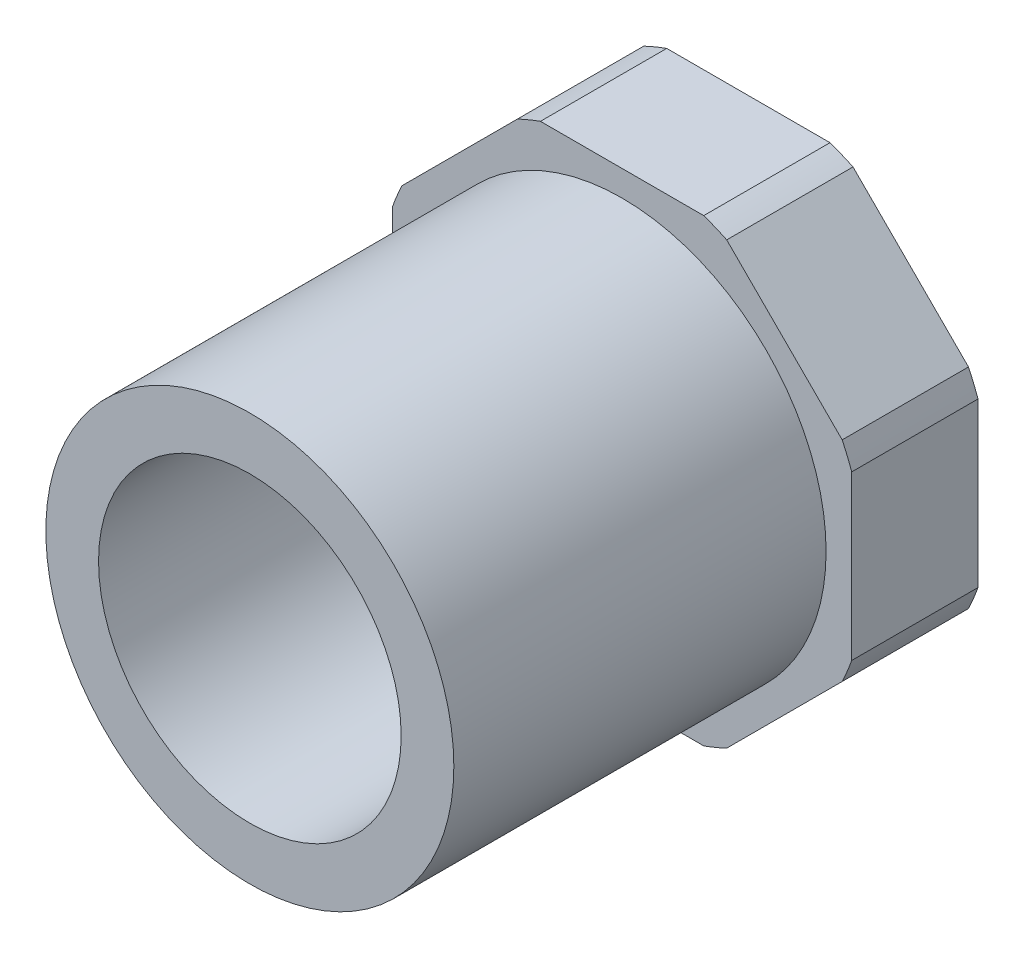
ISO-10303-21;
HEADER;
FILE_DESCRIPTION(('STEP AP214'),'2;1');
FILE_NAME('part.step','',(''),(''),'','','');
FILE_SCHEMA(('AUTOMOTIVE_DESIGN { 1 0 10303 214 1 1 1 1 }'));
ENDSEC;
DATA;
#1=APPLICATION_CONTEXT('core data for automotive mechanical design processes');
#2=APPLICATION_PROTOCOL_DEFINITION('international standard','automotive_design',2000,#1);
#3=PRODUCT_CONTEXT('',#1,'mechanical');
#4=PRODUCT('Part','Part','',(#3));
#5=PRODUCT_RELATED_PRODUCT_CATEGORY('part','',(#4));
#6=PRODUCT_DEFINITION_FORMATION('','',#4);
#7=PRODUCT_DEFINITION_CONTEXT('part definition',#1,'design');
#8=PRODUCT_DEFINITION('design','',#6,#7);
#9=PRODUCT_DEFINITION_SHAPE('','',#8);
#10=(LENGTH_UNIT() NAMED_UNIT(*) SI_UNIT(.MILLI.,.METRE.));
#11=(NAMED_UNIT(*) PLANE_ANGLE_UNIT() SI_UNIT($,.RADIAN.));
#12=(NAMED_UNIT(*) SI_UNIT($,.STERADIAN.) SOLID_ANGLE_UNIT());
#13=UNCERTAINTY_MEASURE_WITH_UNIT(LENGTH_MEASURE(1.E-05),#10,'distance_accuracy_value','');
#14=(GEOMETRIC_REPRESENTATION_CONTEXT(3) GLOBAL_UNCERTAINTY_ASSIGNED_CONTEXT((#13)) GLOBAL_UNIT_ASSIGNED_CONTEXT((#10,
#11,#12)) REPRESENTATION_CONTEXT('',''));
#15=CARTESIAN_POINT('',(0.,0.,0.));
#16=DIRECTION('',(0.,0.,1.));
#17=DIRECTION('',(1.,0.,0.));
#18=AXIS2_PLACEMENT_3D('',#15,#16,#17);
#19=CARTESIAN_POINT('',(0.,0.,13.096875));
#20=DIRECTION('',(0.,0.,1.));
#21=DIRECTION('',(1.,0.,0.));
#22=AXIS2_PLACEMENT_3D('',#19,#20,#21);
#23=CYLINDRICAL_SURFACE('',#22,10.7188);
#24=CARTESIAN_POINT('',(0.,0.,13.096875));
#25=DIRECTION('',(0.,0.,1.));
#26=DIRECTION('',(1.,0.,0.));
#27=AXIS2_PLACEMENT_3D('',#24,#25,#26);
#28=CIRCLE('',#27,10.7188);
#29=CARTESIAN_POINT('',(10.7188,0.,13.096875));
#30=VERTEX_POINT('',#29);
#31=EDGE_CURVE('E179',#30,#30,#28,.T.);
#32=ORIENTED_EDGE('',*,*,#31,.F.);
#33=EDGE_LOOP('',(#32));
#34=FACE_BOUND('',#33,.T.);
#35=CARTESIAN_POINT('',(0.,0.,-6.461125));
#36=DIRECTION('',(0.,0.,-1.));
#37=DIRECTION('',(0.,1.,0.));
#38=AXIS2_PLACEMENT_3D('',#35,#36,#37);
#39=CIRCLE('',#38,10.7188);
#40=CARTESIAN_POINT('',(0.,10.7188,-6.461125));
#41=VERTEX_POINT('',#40);
#42=EDGE_CURVE('E238',#41,#41,#39,.T.);
#43=ORIENTED_EDGE('',*,*,#42,.F.);
#44=EDGE_LOOP('',(#43));
#45=FACE_BOUND('',#44,.T.);
#46=ADVANCED_FACE('F32',(#34,#45),#23,.T.);
#47=CARTESIAN_POINT('',(0.,0.,14.2399258000002));
#48=DIRECTION('',(0.,0.,1.));
#49=DIRECTION('',(0.,-1.,0.));
#50=AXIS2_PLACEMENT_3D('',#47,#48,#49);
#51=SPHERICAL_SURFACE('',#50,20.7010508000002);
#52=CARTESIAN_POINT('',(0.,0.,-6.36579573756222));
#53=DIRECTION('',(0.,0.,1.));
#54=DIRECTION('',(1.,0.,0.));
#55=AXIS2_PLACEMENT_3D('',#52,#53,#54);
#56=CIRCLE('',#55,1.984375);
#57=CARTESIAN_POINT('',(0.,-1.98437500000001,-6.36579573756222));
#58=VERTEX_POINT('',#57);
#59=EDGE_CURVE('E157',#58,#58,#56,.T.);
#60=CARTESIAN_POINT('',(0.,0.,-4.87362500000002));
#61=DIRECTION('',(0.,0.,1.));
#62=DIRECTION('',(1.,0.,0.));
#63=AXIS2_PLACEMENT_3D('',#60,#61,#62);
#64=CIRCLE('',#63,7.95019999999999);
#65=CARTESIAN_POINT('',(0.,-7.95019999999999,-4.87362500000002));
#66=VERTEX_POINT('',#65);
#67=EDGE_CURVE('E185',#66,#66,#64,.T.);
#68=CARTESIAN_POINT('',(0.,-1.98437500000001,-6.36579573756222));
#69=CARTESIAN_POINT('',(0.,-2.04837521383529,-6.35963238964144));
#70=CARTESIAN_POINT('',(0.,-2.11234671120058,-6.35317085188046));
#71=CARTESIAN_POINT('',(0.,-2.24022672321183,-6.33965199847277));
#72=CARTESIAN_POINT('',(0.,-2.3041352378578,-6.33259468282606));
#73=CARTESIAN_POINT('',(0.,-2.43188373465112,-6.31788487544154));
#74=CARTESIAN_POINT('',(0.,-2.49572371679848,-6.31023238370374));
#75=CARTESIAN_POINT('',(0.,-2.62332960623056,-6.29433289146571));
#76=CARTESIAN_POINT('',(0.,-2.68709551351528,-6.28608589096548));
#77=CARTESIAN_POINT('',(0.,-2.81454771689678,-6.26899809643351));
#78=CARTESIAN_POINT('',(0.,-2.87823401299355,-6.26015730240178));
#79=CARTESIAN_POINT('',(0.,-3.00552146469095,-6.2418826885868));
#80=CARTESIAN_POINT('',(0.,-3.06912262029158,-6.23244886880356));
#81=CARTESIAN_POINT('',(0.,-3.19623426905234,-6.21298902248622));
#82=CARTESIAN_POINT('',(0.,-3.25974476221248,-6.20296299595212));
#83=CARTESIAN_POINT('',(0.,-3.38666957202688,-6.18231960662136));
#84=CARTESIAN_POINT('',(0.,-3.45008388868115,-6.17170224382469));
#85=CARTESIAN_POINT('',(0.,-3.5768108397666,-6.14987710377856));
#86=CARTESIAN_POINT('',(0.,-3.64012347419779,-6.13866932652909));
#87=CARTESIAN_POINT('',(0.,-3.76664156394859,-6.11566433065282));
#88=CARTESIAN_POINT('',(0.,-3.82984701926821,-6.10386711202601));
#89=CARTESIAN_POINT('',(0.,-3.95614526321268,-6.07968425764527));
#90=CARTESIAN_POINT('',(0.,-4.01923805183753,-6.06729862189133));
#91=CARTESIAN_POINT('',(0.,-4.14530548459118,-6.04194000859405));
#92=CARTESIAN_POINT('',(0.,-4.20828012871998,-6.0289670310507));
#93=CARTESIAN_POINT('',(0.,-4.3341058049377,-6.00243486050606));
#94=CARTESIAN_POINT('',(0.,-4.39695683702662,-5.98887566750477));
#95=CARTESIAN_POINT('',(0.,-4.52252983235293,-5.96117224327171));
#96=CARTESIAN_POINT('',(0.,-4.58525179559031,-5.94702801203994));
#97=CARTESIAN_POINT('',(0.,-4.7105612076078,-5.91815573936725));
#98=CARTESIAN_POINT('',(0.,-4.77314865638792,-5.90342769792632));
#99=CARTESIAN_POINT('',(0.,-4.89818360556387,-5.87338908354377));
#100=CARTESIAN_POINT('',(0.,-4.96063110595972,-5.85807851060216));
#101=CARTESIAN_POINT('',(0.,-5.08538073659064,-5.82687616250292));
#102=CARTESIAN_POINT('',(0.,-5.14768286682571,-5.81098438734529));
#103=CARTESIAN_POINT('',(0.,-5.27213634797984,-5.77862101455944));
#104=CARTESIAN_POINT('',(0.,-5.33428769889889,-5.76214941693123));
#105=CARTESIAN_POINT('',(0.,-5.45843422535658,-5.72862782929059));
#106=CARTESIAN_POINT('',(0.,-5.52042940089521,-5.71157783927817));
#107=CARTESIAN_POINT('',(0.,-5.64425819408701,-5.67690094717235));
#108=CARTESIAN_POINT('',(0.,-5.70609181174018,-5.65927404507895));
#109=CARTESIAN_POINT('',(0.,-5.82959212068271,-5.62344485920264));
#110=CARTESIAN_POINT('',(0.,-5.89125881197206,-5.60524257541974));
#111=CARTESIAN_POINT('',(0.,-6.01441991420135,-5.56826420651137));
#112=CARTESIAN_POINT('',(0.,-6.07591432514129,-5.5494881213859));
#113=CARTESIAN_POINT('',(0.,-6.19872552764375,-5.51136377995744));
#114=CARTESIAN_POINT('',(0.,-6.26004231920628,-5.49201552365445));
#115=CARTESIAN_POINT('',(0.,-6.38249295934721,-5.45274851971302));
#116=CARTESIAN_POINT('',(0.,-6.44362680792561,-5.43282977207457));
#117=CARTESIAN_POINT('',(0.,-6.56570625437441,-5.39242351483385));
#118=CARTESIAN_POINT('',(0.,-6.6266518522448,-5.37193600523156));
#119=CARTESIAN_POINT('',(0.,-6.74834950589984,-5.33039400282024));
#120=CARTESIAN_POINT('',(0.,-6.80910156168448,-5.3093395100112));
#121=CARTESIAN_POINT('',(0.,-6.9304068565866,-5.26666536915185));
#122=CARTESIAN_POINT('',(0.,-6.99096009570409,-5.24504572110154));
#123=CARTESIAN_POINT('',(0.,-7.111862499979,-5.20124314685926));
#124=CARTESIAN_POINT('',(0.,-7.17221166513643,-5.17906022066729));
#125=CARTESIAN_POINT('',(0.,-7.29270068181566,-5.13413301589739));
#126=CARTESIAN_POINT('',(0.,-7.35284053333746,-5.11138873731945));
#127=CARTESIAN_POINT('',(0.,-7.47290570161841,-5.0653408031981));
#128=CARTESIAN_POINT('',(0.,-7.53283101837757,-5.04203714765469));
#129=CARTESIAN_POINT('',(0.,-7.6524619132304,-4.99487248012746));
#130=CARTESIAN_POINT('',(0.,-7.71216749132408,-4.97101146814365));
#131=CARTESIAN_POINT('',(0.,-7.83135372925355,-4.92273416956888));
#132=CARTESIAN_POINT('',(0.,-7.89083438908934,-4.89831788297792));
#133=CARTESIAN_POINT('',(0.,-7.95019999999999,-4.87362500000002));
#134=B_SPLINE_CURVE_WITH_KNOTS('',3,(#68,#69,#70,#71,#72,#73,#74,#75,#76,#77,#78,#79,#80,#81,
#82,#83,#84,#85,#86,#87,#88,#89,#90,#91,#92,#93,#94,#95,#96,#97,#98,#99,#100,#101,#102,#103,
#104,#105,#106,#107,#108,#109,#110,#111,#112,#113,#114,#115,#116,#117,#118,#119,#120,#121,#122,
#123,#124,#125,#126,#127,#128,#129,#130,#131,#132,#133),.UNSPECIFIED.,.F.,.F.,(4,2,2,2,2,2,2,2,
2,2,2,2,2,2,2,2,2,2,2,2,2,2,2,2,2,2,2,2,2,2,2,2,4),(0.,0.192888202769622,0.38577640553924,
0.578664608308862,0.771552811078485,0.964441013848102,1.15732921661772,1.35021741938735,
1.54310562215697,1.73599382492659,1.92888202769621,2.12177023046583,2.31465843323545,
2.50754663600507,2.70043483877469,2.89332304154431,3.08621124431393,3.27909944708355,
3.47198764985317,3.6648758526228,3.85776405539242,4.05065225816204,4.24354046093166,
4.43642866370128,4.6293168664709,4.82220506924052,5.01509327201014,5.20798147477976,
5.40086967754938,5.593757880319,5.78664608308862,5.97953428585824,6.17242248862787),.UNSPECIFIED.);
#135=EDGE_CURVE('BSEAM34',#58,#66,#134,.T.);
#136=ORIENTED_EDGE('',*,*,#59,.F.);
#137=ORIENTED_EDGE('',*,*,#67,.T.);
#138=ORIENTED_EDGE('',*,*,#135,.T.);
#139=ORIENTED_EDGE('',*,*,#135,.F.);
#140=EDGE_LOOP('',(#136,#138,#137,#139));
#141=FACE_BOUND('',#140,.T.);
#142=ADVANCED_FACE('F34',(#141),#51,.F.);
#143=CARTESIAN_POINT('',(0.,0.,13.096875));
#144=DIRECTION('',(0.,0.,1.));
#145=DIRECTION('',(1.,0.,0.));
#146=AXIS2_PLACEMENT_3D('',#143,#144,#145);
#147=CYLINDRICAL_SURFACE('',#146,7.95019999999999);
#148=CARTESIAN_POINT('',(0.,0.,13.096875));
#149=DIRECTION('',(0.,0.,1.));
#150=DIRECTION('',(1.,0.,0.));
#151=AXIS2_PLACEMENT_3D('',#148,#149,#150);
#152=CIRCLE('',#151,7.95019999999999);
#153=CARTESIAN_POINT('',(7.95019999999999,0.,13.096875));
#154=VERTEX_POINT('',#153);
#155=EDGE_CURVE('E182',#154,#154,#152,.T.);
#156=ORIENTED_EDGE('',*,*,#155,.T.);
#157=EDGE_LOOP('',(#156));
#158=FACE_BOUND('',#157,.T.);
#159=ORIENTED_EDGE('',*,*,#67,.F.);
#160=EDGE_LOOP('',(#159));
#161=FACE_BOUND('',#160,.T.);
#162=ADVANCED_FACE('F314',(#158,#161),#147,.F.);
#163=CARTESIAN_POINT('',(0.,-10.7188,13.096875));
#164=DIRECTION('',(0.,0.,1.));
#165=DIRECTION('',(1.,0.,0.));
#166=AXIS2_PLACEMENT_3D('',#163,#164,#165);
#167=PLANE('',#166);
#168=ORIENTED_EDGE('',*,*,#31,.T.);
#169=EDGE_LOOP('',(#168));
#170=FACE_BOUND('',#169,.T.);
#171=ORIENTED_EDGE('',*,*,#155,.F.);
#172=EDGE_LOOP('',(#171));
#173=FACE_BOUND('',#172,.T.);
#174=ADVANCED_FACE('F319',(#170,#173),#167,.T.);
#175=CARTESIAN_POINT('',(-12.065,4.99748663003139,-6.461125));
#176=DIRECTION('',(-0.707106781186547,0.707106781186548,0.));
#177=DIRECTION('',(-0.707106781186548,-0.707106781186547,0.));
#178=AXIS2_PLACEMENT_3D('',#175,#176,#177);
#179=PLANE('',#178);
#180=DIRECTION('',(0.,0.,-1.));
#181=VECTOR('',#180,1.);
#182=CARTESIAN_POINT('',(-5.49764931005171,11.5648373199796,-6.461125));
#183=LINE('',#182,#181);
#184=CARTESIAN_POINT('',(-5.49764931005171,11.5648373199796,-13.096875));
#185=VERTEX_POINT('',#184);
#186=CARTESIAN_POINT('',(-5.49764931005171,11.5648373199796,-6.461125));
#187=VERTEX_POINT('',#186);
#188=EDGE_CURVE('E257',#185,#187,#183,.F.);
#189=ORIENTED_EDGE('',*,*,#188,.F.);
#190=DIRECTION('',(0.707106781186548,0.707106781186547,0.));
#191=VECTOR('',#190,1.);
#192=CARTESIAN_POINT('',(-12.065,4.99748663003139,-13.096875));
#193=LINE('',#192,#191);
#194=CARTESIAN_POINT('',(-11.5648373199796,5.49764931005173,-13.096875));
#195=VERTEX_POINT('',#194);
#196=EDGE_CURVE('E236',#195,#185,#193,.T.);
#197=ORIENTED_EDGE('',*,*,#196,.F.);
#198=DIRECTION('',(0.,0.,-1.));
#199=VECTOR('',#198,1.);
#200=CARTESIAN_POINT('',(-11.5648373199796,5.49764931005173,-6.461125));
#201=LINE('',#200,#199);
#202=CARTESIAN_POINT('',(-11.5648373199796,5.49764931005173,-6.461125));
#203=VERTEX_POINT('',#202);
#204=EDGE_CURVE('E151',#203,#195,#201,.T.);
#205=ORIENTED_EDGE('',*,*,#204,.F.);
#206=DIRECTION('',(0.707106781186548,0.707106781186547,0.));
#207=VECTOR('',#206,1.);
#208=CARTESIAN_POINT('',(-12.065,4.99748663003139,-6.461125));
#209=LINE('',#208,#207);
#210=EDGE_CURVE('E169',#203,#187,#209,.T.);
#211=ORIENTED_EDGE('',*,*,#210,.T.);
#212=EDGE_LOOP('',(#189,#197,#205,#211));
#213=FACE_BOUND('',#212,.T.);
#214=ADVANCED_FACE('F321',(#213),#179,.T.);
#215=CARTESIAN_POINT('',(-12.065,-4.99748663003137,-6.461125));
#216=DIRECTION('',(-1.,0.,0.));
#217=DIRECTION('',(0.,-1.,0.));
#218=AXIS2_PLACEMENT_3D('',#215,#216,#217);
#219=PLANE('',#218);
#220=DIRECTION('',(0.,0.,-1.));
#221=VECTOR('',#220,1.);
#222=CARTESIAN_POINT('',(-12.065,4.29014978455376,-6.461125));
#223=LINE('',#222,#221);
#224=CARTESIAN_POINT('',(-12.065,4.29014978455375,-13.096875));
#225=VERTEX_POINT('',#224);
#226=CARTESIAN_POINT('',(-12.065,4.29014978455375,-6.461125));
#227=VERTEX_POINT('',#226);
#228=EDGE_CURVE('E148',#225,#227,#223,.F.);
#229=ORIENTED_EDGE('',*,*,#228,.F.);
#230=DIRECTION('',(0.,1.,0.));
#231=VECTOR('',#230,1.);
#232=CARTESIAN_POINT('',(-12.065,-4.99748663003137,-13.096875));
#233=LINE('',#232,#231);
#234=CARTESIAN_POINT('',(-12.065,-4.29014978455375,-13.096875));
#235=VERTEX_POINT('',#234);
#236=EDGE_CURVE('E163',#235,#225,#233,.T.);
#237=ORIENTED_EDGE('',*,*,#236,.F.);
#238=DIRECTION('',(0.,0.,-1.));
#239=VECTOR('',#238,1.);
#240=CARTESIAN_POINT('',(-12.065,-4.29014978455375,-6.461125));
#241=LINE('',#240,#239);
#242=CARTESIAN_POINT('',(-12.065,-4.29014978455375,-6.461125));
#243=VERTEX_POINT('',#242);
#244=EDGE_CURVE('E48',#243,#235,#241,.T.);
#245=ORIENTED_EDGE('',*,*,#244,.F.);
#246=DIRECTION('',(0.,1.,0.));
#247=VECTOR('',#246,1.);
#248=CARTESIAN_POINT('',(-12.065,-4.99748663003137,-6.461125));
#249=LINE('',#248,#247);
#250=EDGE_CURVE('E165',#243,#227,#249,.T.);
#251=ORIENTED_EDGE('',*,*,#250,.T.);
#252=EDGE_LOOP('',(#229,#237,#245,#251));
#253=FACE_BOUND('',#252,.T.);
#254=ADVANCED_FACE('F162',(#253),#219,.T.);
#255=CARTESIAN_POINT('',(-4.99748663003138,-12.065,-6.461125));
#256=DIRECTION('',(-0.707106781186548,-0.707106781186547,0.));
#257=DIRECTION('',(0.707106781186547,-0.707106781186548,0.));
#258=AXIS2_PLACEMENT_3D('',#255,#256,#257);
#259=PLANE('',#258);
#260=DIRECTION('',(0.,0.,-1.));
#261=VECTOR('',#260,1.);
#262=CARTESIAN_POINT('',(-11.5648373199797,-5.4976493100517,-6.461125));
#263=LINE('',#262,#261);
#264=CARTESIAN_POINT('',(-11.5648373199797,-5.49764931005169,-13.096875));
#265=VERTEX_POINT('',#264);
#266=CARTESIAN_POINT('',(-11.5648373199797,-5.49764931005169,-6.461125));
#267=VERTEX_POINT('',#266);
#268=EDGE_CURVE('E261',#265,#267,#263,.F.);
#269=ORIENTED_EDGE('',*,*,#268,.F.);
#270=DIRECTION('',(-0.707106781186547,0.707106781186548,0.));
#271=VECTOR('',#270,1.);
#272=CARTESIAN_POINT('',(-4.99748663003138,-12.065,-13.096875));
#273=LINE('',#272,#271);
#274=CARTESIAN_POINT('',(-5.4976493100517,-11.5648373199796,-13.096875));
#275=VERTEX_POINT('',#274);
#276=EDGE_CURVE('E170',#275,#265,#273,.T.);
#277=ORIENTED_EDGE('',*,*,#276,.F.);
#278=DIRECTION('',(0.,0.,-1.));
#279=VECTOR('',#278,1.);
#280=CARTESIAN_POINT('',(-5.4976493100517,-11.5648373199796,-6.461125));
#281=LINE('',#280,#279);
#282=CARTESIAN_POINT('',(-5.4976493100517,-11.5648373199796,-6.461125));
#283=VERTEX_POINT('',#282);
#284=EDGE_CURVE('E56',#283,#275,#281,.T.);
#285=ORIENTED_EDGE('',*,*,#284,.F.);
#286=DIRECTION('',(-0.707106781186547,0.707106781186548,0.));
#287=VECTOR('',#286,1.);
#288=CARTESIAN_POINT('',(-4.99748663003138,-12.065,-6.461125));
#289=LINE('',#288,#287);
#290=EDGE_CURVE('E240',#283,#267,#289,.T.);
#291=ORIENTED_EDGE('',*,*,#290,.T.);
#292=EDGE_LOOP('',(#269,#277,#285,#291));
#293=FACE_BOUND('',#292,.T.);
#294=ADVANCED_FACE('F348',(#293),#259,.T.);
#295=CARTESIAN_POINT('',(4.99748663003136,-12.065,-6.461125));
#296=DIRECTION('',(0.,-1.,0.));
#297=DIRECTION('',(1.,0.,0.));
#298=AXIS2_PLACEMENT_3D('',#295,#296,#297);
#299=PLANE('',#298);
#300=DIRECTION('',(0.,0.,-1.));
#301=VECTOR('',#300,1.);
#302=CARTESIAN_POINT('',(-4.29014978455377,-12.065,-6.461125));
#303=LINE('',#302,#301);
#304=CARTESIAN_POINT('',(-4.29014978455375,-12.065,-13.096875));
#305=VERTEX_POINT('',#304);
#306=CARTESIAN_POINT('',(-4.29014978455376,-12.065,-6.461125));
#307=VERTEX_POINT('',#306);
#308=EDGE_CURVE('E210',#305,#307,#303,.F.);
#309=ORIENTED_EDGE('',*,*,#308,.F.);
#310=DIRECTION('',(-1.,0.,0.));
#311=VECTOR('',#310,1.);
#312=CARTESIAN_POINT('',(4.99748663003136,-12.065,-13.096875));
#313=LINE('',#312,#311);
#314=CARTESIAN_POINT('',(4.29014978455375,-12.065,-13.096875));
#315=VERTEX_POINT('',#314);
#316=EDGE_CURVE('E175',#315,#305,#313,.T.);
#317=ORIENTED_EDGE('',*,*,#316,.F.);
#318=DIRECTION('',(0.,0.,-1.));
#319=VECTOR('',#318,1.);
#320=CARTESIAN_POINT('',(4.29014978455376,-12.065,-6.461125));
#321=LINE('',#320,#319);
#322=CARTESIAN_POINT('',(4.29014978455375,-12.065,-6.461125));
#323=VERTEX_POINT('',#322);
#324=EDGE_CURVE('E221',#323,#315,#321,.T.);
#325=ORIENTED_EDGE('',*,*,#324,.F.);
#326=DIRECTION('',(-1.,0.,0.));
#327=VECTOR('',#326,1.);
#328=CARTESIAN_POINT('',(4.99748663003136,-12.065,-6.461125));
#329=LINE('',#328,#327);
#330=EDGE_CURVE('E220',#323,#307,#329,.T.);
#331=ORIENTED_EDGE('',*,*,#330,.T.);
#332=EDGE_LOOP('',(#309,#317,#325,#331));
#333=FACE_BOUND('',#332,.T.);
#334=ADVANCED_FACE('F217',(#333),#299,.T.);
#335=CARTESIAN_POINT('',(12.065,-4.99748663003137,-6.461125));
#336=DIRECTION('',(0.707106781186547,-0.707106781186548,0.));
#337=DIRECTION('',(0.707106781186548,0.707106781186547,0.));
#338=AXIS2_PLACEMENT_3D('',#335,#336,#337);
#339=PLANE('',#338);
#340=DIRECTION('',(0.,0.,-1.));
#341=VECTOR('',#340,1.);
#342=CARTESIAN_POINT('',(5.49764931005168,-11.5648373199797,-6.461125));
#343=LINE('',#342,#341);
#344=CARTESIAN_POINT('',(5.49764931005168,-11.5648373199797,-13.096875));
#345=VERTEX_POINT('',#344);
#346=CARTESIAN_POINT('',(5.49764931005168,-11.5648373199797,-6.461125));
#347=VERTEX_POINT('',#346);
#348=EDGE_CURVE('E265',#345,#347,#343,.F.);
#349=ORIENTED_EDGE('',*,*,#348,.F.);
#350=DIRECTION('',(-0.707106781186548,-0.707106781186547,0.));
#351=VECTOR('',#350,1.);
#352=CARTESIAN_POINT('',(12.065,-4.99748663003137,-13.096875));
#353=LINE('',#352,#351);
#354=CARTESIAN_POINT('',(11.5648373199797,-5.4976493100517,-13.096875));
#355=VERTEX_POINT('',#354);
#356=EDGE_CURVE('E224',#355,#345,#353,.T.);
#357=ORIENTED_EDGE('',*,*,#356,.F.);
#358=DIRECTION('',(0.,0.,-1.));
#359=VECTOR('',#358,1.);
#360=CARTESIAN_POINT('',(11.5648373199797,-5.4976493100517,-6.461125));
#361=LINE('',#360,#359);
#362=CARTESIAN_POINT('',(11.5648373199796,-5.4976493100517,-6.461125));
#363=VERTEX_POINT('',#362);
#364=EDGE_CURVE('E267',#363,#355,#361,.T.);
#365=ORIENTED_EDGE('',*,*,#364,.F.);
#366=DIRECTION('',(-0.707106781186548,-0.707106781186547,0.));
#367=VECTOR('',#366,1.);
#368=CARTESIAN_POINT('',(12.065,-4.99748663003137,-6.461125));
#369=LINE('',#368,#367);
#370=EDGE_CURVE('E244',#363,#347,#369,.T.);
#371=ORIENTED_EDGE('',*,*,#370,.T.);
#372=EDGE_LOOP('',(#349,#357,#365,#371));
#373=FACE_BOUND('',#372,.T.);
#374=ADVANCED_FACE('F362',(#373),#339,.T.);
#375=CARTESIAN_POINT('',(12.065,4.99748663003136,-6.461125));
#376=DIRECTION('',(1.,0.,0.));
#377=DIRECTION('',(0.,1.,0.));
#378=AXIS2_PLACEMENT_3D('',#375,#376,#377);
#379=PLANE('',#378);
#380=DIRECTION('',(0.,0.,-1.));
#381=VECTOR('',#380,1.);
#382=CARTESIAN_POINT('',(12.065,-4.29014978455375,-6.461125));
#383=LINE('',#382,#381);
#384=CARTESIAN_POINT('',(12.065,-4.29014978455375,-13.096875));
#385=VERTEX_POINT('',#384);
#386=CARTESIAN_POINT('',(12.065,-4.29014978455375,-6.461125));
#387=VERTEX_POINT('',#386);
#388=EDGE_CURVE('E269',#385,#387,#383,.F.);
#389=ORIENTED_EDGE('',*,*,#388,.F.);
#390=DIRECTION('',(0.,-1.,0.));
#391=VECTOR('',#390,1.);
#392=CARTESIAN_POINT('',(12.065,4.99748663003136,-13.096875));
#393=LINE('',#392,#391);
#394=CARTESIAN_POINT('',(12.065,4.29014978455374,-13.096875));
#395=VERTEX_POINT('',#394);
#396=EDGE_CURVE('E225',#395,#385,#393,.T.);
#397=ORIENTED_EDGE('',*,*,#396,.F.);
#398=DIRECTION('',(0.,0.,-1.));
#399=VECTOR('',#398,1.);
#400=CARTESIAN_POINT('',(12.065,4.29014978455374,-6.461125));
#401=LINE('',#400,#399);
#402=CARTESIAN_POINT('',(12.065,4.29014978455374,-6.461125));
#403=VERTEX_POINT('',#402);
#404=EDGE_CURVE('E271',#403,#395,#401,.T.);
#405=ORIENTED_EDGE('',*,*,#404,.F.);
#406=DIRECTION('',(0.,-1.,0.));
#407=VECTOR('',#406,1.);
#408=CARTESIAN_POINT('',(12.065,4.99748663003136,-6.461125));
#409=LINE('',#408,#407);
#410=EDGE_CURVE('E247',#403,#387,#409,.T.);
#411=ORIENTED_EDGE('',*,*,#410,.T.);
#412=EDGE_LOOP('',(#389,#397,#405,#411));
#413=FACE_BOUND('',#412,.T.);
#414=ADVANCED_FACE('F369',(#413),#379,.T.);
#415=CARTESIAN_POINT('',(4.99748663003136,12.065,-6.461125));
#416=DIRECTION('',(0.707106781186548,0.707106781186547,0.));
#417=DIRECTION('',(-0.707106781186547,0.707106781186548,0.));
#418=AXIS2_PLACEMENT_3D('',#415,#416,#417);
#419=PLANE('',#418);
#420=DIRECTION('',(0.,0.,-1.));
#421=VECTOR('',#420,1.);
#422=CARTESIAN_POINT('',(11.5648373199797,5.49764931005169,-6.461125));
#423=LINE('',#422,#421);
#424=CARTESIAN_POINT('',(11.5648373199797,5.49764931005169,-13.096875));
#425=VERTEX_POINT('',#424);
#426=CARTESIAN_POINT('',(11.5648373199797,5.49764931005169,-6.461125));
#427=VERTEX_POINT('',#426);
#428=EDGE_CURVE('E273',#425,#427,#423,.F.);
#429=ORIENTED_EDGE('',*,*,#428,.F.);
#430=DIRECTION('',(0.707106781186547,-0.707106781186548,0.));
#431=VECTOR('',#430,1.);
#432=CARTESIAN_POINT('',(4.99748663003136,12.065,-13.096875));
#433=LINE('',#432,#431);
#434=CARTESIAN_POINT('',(5.49764931005171,11.5648373199796,-13.096875));
#435=VERTEX_POINT('',#434);
#436=EDGE_CURVE('E230',#435,#425,#433,.T.);
#437=ORIENTED_EDGE('',*,*,#436,.F.);
#438=DIRECTION('',(0.,0.,-1.));
#439=VECTOR('',#438,1.);
#440=CARTESIAN_POINT('',(5.49764931005171,11.5648373199796,-6.461125));
#441=LINE('',#440,#439);
#442=CARTESIAN_POINT('',(5.49764931005171,11.5648373199796,-6.461125));
#443=VERTEX_POINT('',#442);
#444=EDGE_CURVE('E275',#443,#435,#441,.T.);
#445=ORIENTED_EDGE('',*,*,#444,.F.);
#446=DIRECTION('',(0.707106781186547,-0.707106781186548,0.));
#447=VECTOR('',#446,1.);
#448=CARTESIAN_POINT('',(4.99748663003136,12.065,-6.461125));
#449=LINE('',#448,#447);
#450=EDGE_CURVE('E250',#443,#427,#449,.T.);
#451=ORIENTED_EDGE('',*,*,#450,.T.);
#452=EDGE_LOOP('',(#429,#437,#445,#451));
#453=FACE_BOUND('',#452,.T.);
#454=ADVANCED_FACE('F377',(#453),#419,.T.);
#455=CARTESIAN_POINT('',(-4.99748663003136,12.065,-6.461125));
#456=DIRECTION('',(0.,1.,0.));
#457=DIRECTION('',(-1.,0.,0.));
#458=AXIS2_PLACEMENT_3D('',#455,#456,#457);
#459=PLANE('',#458);
#460=DIRECTION('',(0.,0.,-1.));
#461=VECTOR('',#460,1.);
#462=CARTESIAN_POINT('',(4.29014978455372,12.065,-6.461125));
#463=LINE('',#462,#461);
#464=CARTESIAN_POINT('',(4.29014978455371,12.065,-13.096875));
#465=VERTEX_POINT('',#464);
#466=CARTESIAN_POINT('',(4.29014978455371,12.065,-6.461125));
#467=VERTEX_POINT('',#466);
#468=EDGE_CURVE('E277',#465,#467,#463,.F.);
#469=ORIENTED_EDGE('',*,*,#468,.F.);
#470=DIRECTION('',(1.,0.,0.));
#471=VECTOR('',#470,1.);
#472=CARTESIAN_POINT('',(-4.99748663003136,12.065,-13.096875));
#473=LINE('',#472,#471);
#474=CARTESIAN_POINT('',(-4.2901497845537,12.065,-13.096875));
#475=VERTEX_POINT('',#474);
#476=EDGE_CURVE('E233',#475,#465,#473,.T.);
#477=ORIENTED_EDGE('',*,*,#476,.F.);
#478=DIRECTION('',(0.,0.,-1.));
#479=VECTOR('',#478,1.);
#480=CARTESIAN_POINT('',(-4.2901497845537,12.065,-6.461125));
#481=LINE('',#480,#479);
#482=CARTESIAN_POINT('',(-4.29014978455369,12.065,-6.461125));
#483=VERTEX_POINT('',#482);
#484=EDGE_CURVE('E279',#483,#475,#481,.T.);
#485=ORIENTED_EDGE('',*,*,#484,.F.);
#486=DIRECTION('',(1.,0.,0.));
#487=VECTOR('',#486,1.);
#488=CARTESIAN_POINT('',(-4.99748663003136,12.065,-6.461125));
#489=LINE('',#488,#487);
#490=EDGE_CURVE('E173',#483,#467,#489,.T.);
#491=ORIENTED_EDGE('',*,*,#490,.T.);
#492=EDGE_LOOP('',(#469,#477,#485,#491));
#493=FACE_BOUND('',#492,.T.);
#494=ADVANCED_FACE('F304',(#493),#459,.T.);
#495=CARTESIAN_POINT('',(0.,0.,-6.461125));
#496=DIRECTION('',(0.,0.,-1.));
#497=DIRECTION('',(-1.,0.,0.));
#498=AXIS2_PLACEMENT_3D('',#495,#496,#497);
#499=PLANE('',#498);
#500=ORIENTED_EDGE('',*,*,#42,.T.);
#501=EDGE_LOOP('',(#500));
#502=FACE_BOUND('',#501,.T.);
#503=ORIENTED_EDGE('',*,*,#250,.F.);
#504=CARTESIAN_POINT('',(0.,0.,-6.461125));
#505=DIRECTION('',(0.,0.,-1.));
#506=DIRECTION('',(-1.,0.,0.));
#507=AXIS2_PLACEMENT_3D('',#504,#505,#506);
#508=CIRCLE('',#507,12.8050618965277);
#509=EDGE_CURVE('E156',#267,#243,#508,.T.);
#510=ORIENTED_EDGE('',*,*,#509,.F.);
#511=ORIENTED_EDGE('',*,*,#290,.F.);
#512=EDGE_CURVE('E476',#307,#283,#508,.T.);
#513=ORIENTED_EDGE('',*,*,#512,.F.);
#514=ORIENTED_EDGE('',*,*,#330,.F.);
#515=EDGE_CURVE('E472',#347,#323,#508,.T.);
#516=ORIENTED_EDGE('',*,*,#515,.F.);
#517=ORIENTED_EDGE('',*,*,#370,.F.);
#518=EDGE_CURVE('E478',#387,#363,#508,.T.);
#519=ORIENTED_EDGE('',*,*,#518,.F.);
#520=ORIENTED_EDGE('',*,*,#410,.F.);
#521=EDGE_CURVE('E490',#427,#403,#508,.T.);
#522=ORIENTED_EDGE('',*,*,#521,.F.);
#523=ORIENTED_EDGE('',*,*,#450,.F.);
#524=EDGE_CURVE('E486',#467,#443,#508,.T.);
#525=ORIENTED_EDGE('',*,*,#524,.F.);
#526=ORIENTED_EDGE('',*,*,#490,.F.);
#527=EDGE_CURVE('E282',#187,#483,#508,.T.);
#528=ORIENTED_EDGE('',*,*,#527,.F.);
#529=ORIENTED_EDGE('',*,*,#210,.F.);
#530=EDGE_CURVE('E281',#227,#203,#508,.T.);
#531=ORIENTED_EDGE('',*,*,#530,.F.);
#532=EDGE_LOOP('',(#503,#510,#511,#513,#514,#516,#517,#519,#520,#522,#523,#525,#526,#528,#529,#531));
#533=FACE_BOUND('',#532,.T.);
#534=ADVANCED_FACE('F293',(#502,#533),#499,.F.);
#535=CARTESIAN_POINT('',(0.,0.,-13.096875));
#536=DIRECTION('',(0.,0.,-1.));
#537=DIRECTION('',(-1.,0.,0.));
#538=AXIS2_PLACEMENT_3D('',#535,#536,#537);
#539=PLANE('',#538);
#540=CARTESIAN_POINT('',(0.,0.,-13.096875));
#541=DIRECTION('',(0.,0.,-1.));
#542=DIRECTION('',(-1.,0.,0.));
#543=AXIS2_PLACEMENT_3D('',#540,#541,#542);
#544=CIRCLE('',#543,1.984375);
#545=CARTESIAN_POINT('',(-1.984375,0.,-13.096875));
#546=VERTEX_POINT('',#545);
#547=EDGE_CURVE('E36',#546,#546,#544,.T.);
#548=ORIENTED_EDGE('',*,*,#547,.F.);
#549=EDGE_LOOP('',(#548));
#550=FACE_BOUND('',#549,.T.);
#551=CARTESIAN_POINT('',(0.,0.,-13.096875));
#552=DIRECTION('',(0.,0.,-1.));
#553=DIRECTION('',(-1.,0.,0.));
#554=AXIS2_PLACEMENT_3D('',#551,#552,#553);
#555=CIRCLE('',#554,12.8050618965277);
#556=EDGE_CURVE('E11',#235,#265,#555,.F.);
#557=ORIENTED_EDGE('',*,*,#556,.F.);
#558=ORIENTED_EDGE('',*,*,#236,.T.);
#559=CARTESIAN_POINT('',(0.,0.,-13.096875));
#560=DIRECTION('',(0.,0.,-1.));
#561=DIRECTION('',(-1.,0.,0.));
#562=AXIS2_PLACEMENT_3D('',#559,#560,#561);
#563=CIRCLE('',#562,12.8050618965277);
#564=EDGE_CURVE('E145',#225,#195,#563,.T.);
#565=ORIENTED_EDGE('',*,*,#564,.T.);
#566=ORIENTED_EDGE('',*,*,#196,.T.);
#567=EDGE_CURVE('E42',#475,#185,#555,.F.);
#568=ORIENTED_EDGE('',*,*,#567,.F.);
#569=ORIENTED_EDGE('',*,*,#476,.T.);
#570=EDGE_CURVE('E189',#435,#465,#555,.F.);
#571=ORIENTED_EDGE('',*,*,#570,.F.);
#572=ORIENTED_EDGE('',*,*,#436,.T.);
#573=EDGE_CURVE('E193',#395,#425,#555,.F.);
#574=ORIENTED_EDGE('',*,*,#573,.F.);
#575=ORIENTED_EDGE('',*,*,#396,.T.);
#576=EDGE_CURVE('E197',#355,#385,#555,.F.);
#577=ORIENTED_EDGE('',*,*,#576,.F.);
#578=ORIENTED_EDGE('',*,*,#356,.T.);
#579=EDGE_CURVE('E201',#315,#345,#555,.F.);
#580=ORIENTED_EDGE('',*,*,#579,.F.);
#581=ORIENTED_EDGE('',*,*,#316,.T.);
#582=EDGE_CURVE('E41',#275,#305,#555,.F.);
#583=ORIENTED_EDGE('',*,*,#582,.F.);
#584=ORIENTED_EDGE('',*,*,#276,.T.);
#585=EDGE_LOOP('',(#557,#558,#565,#566,#568,#569,#571,#572,#574,#575,#577,#578,#580,#581,#583,#584));
#586=FACE_BOUND('',#585,.T.);
#587=ADVANCED_FACE('F167',(#550,#586),#539,.T.);
#588=CARTESIAN_POINT('',(0.,0.,-6.461125));
#589=DIRECTION('',(0.,0.,-1.));
#590=DIRECTION('',(-1.,0.,0.));
#591=AXIS2_PLACEMENT_3D('',#588,#589,#590);
#592=CYLINDRICAL_SURFACE('',#591,12.8050618965277);
#593=ORIENTED_EDGE('',*,*,#204,.T.);
#594=ORIENTED_EDGE('',*,*,#564,.F.);
#595=ORIENTED_EDGE('',*,*,#228,.T.);
#596=ORIENTED_EDGE('',*,*,#530,.T.);
#597=EDGE_LOOP('',(#593,#594,#595,#596));
#598=FACE_BOUND('',#597,.T.);
#599=ADVANCED_FACE('F147',(#598),#592,.T.);
#600=ORIENTED_EDGE('',*,*,#188,.T.);
#601=ORIENTED_EDGE('',*,*,#527,.T.);
#602=ORIENTED_EDGE('',*,*,#484,.T.);
#603=ORIENTED_EDGE('',*,*,#567,.T.);
#604=EDGE_LOOP('',(#600,#601,#602,#603));
#605=FACE_BOUND('',#604,.T.);
#606=ADVANCED_FACE('F300',(#605),#592,.T.);
#607=ORIENTED_EDGE('',*,*,#444,.T.);
#608=ORIENTED_EDGE('',*,*,#570,.T.);
#609=ORIENTED_EDGE('',*,*,#468,.T.);
#610=ORIENTED_EDGE('',*,*,#524,.T.);
#611=EDGE_LOOP('',(#607,#608,#609,#610));
#612=FACE_BOUND('',#611,.T.);
#613=ADVANCED_FACE('F412',(#612),#592,.T.);
#614=ORIENTED_EDGE('',*,*,#404,.T.);
#615=ORIENTED_EDGE('',*,*,#573,.T.);
#616=ORIENTED_EDGE('',*,*,#428,.T.);
#617=ORIENTED_EDGE('',*,*,#521,.T.);
#618=EDGE_LOOP('',(#614,#615,#616,#617));
#619=FACE_BOUND('',#618,.T.);
#620=ADVANCED_FACE('F418',(#619),#592,.T.);
#621=ORIENTED_EDGE('',*,*,#364,.T.);
#622=ORIENTED_EDGE('',*,*,#576,.T.);
#623=ORIENTED_EDGE('',*,*,#388,.T.);
#624=ORIENTED_EDGE('',*,*,#518,.T.);
#625=EDGE_LOOP('',(#621,#622,#623,#624));
#626=FACE_BOUND('',#625,.T.);
#627=ADVANCED_FACE('F424',(#626),#592,.T.);
#628=ORIENTED_EDGE('',*,*,#324,.T.);
#629=ORIENTED_EDGE('',*,*,#579,.T.);
#630=ORIENTED_EDGE('',*,*,#348,.T.);
#631=ORIENTED_EDGE('',*,*,#515,.T.);
#632=EDGE_LOOP('',(#628,#629,#630,#631));
#633=FACE_BOUND('',#632,.T.);
#634=ADVANCED_FACE('F430',(#633),#592,.T.);
#635=ORIENTED_EDGE('',*,*,#284,.T.);
#636=ORIENTED_EDGE('',*,*,#582,.T.);
#637=ORIENTED_EDGE('',*,*,#308,.T.);
#638=ORIENTED_EDGE('',*,*,#512,.T.);
#639=EDGE_LOOP('',(#635,#636,#637,#638));
#640=FACE_BOUND('',#639,.T.);
#641=ADVANCED_FACE('F209',(#640),#592,.T.);
#642=ORIENTED_EDGE('',*,*,#244,.T.);
#643=ORIENTED_EDGE('',*,*,#556,.T.);
#644=ORIENTED_EDGE('',*,*,#268,.T.);
#645=ORIENTED_EDGE('',*,*,#509,.T.);
#646=EDGE_LOOP('',(#642,#643,#644,#645));
#647=FACE_BOUND('',#646,.T.);
#648=ADVANCED_FACE('F302',(#647),#592,.T.);
#649=CARTESIAN_POINT('',(0.,0.,-37.703125));
#650=DIRECTION('',(0.,0.,1.));
#651=DIRECTION('',(1.,0.,0.));
#652=AXIS2_PLACEMENT_3D('',#649,#650,#651);
#653=CYLINDRICAL_SURFACE('',#652,1.984375);
#654=ORIENTED_EDGE('',*,*,#59,.T.);
#655=EDGE_LOOP('',(#654));
#656=FACE_BOUND('',#655,.T.);
#657=ORIENTED_EDGE('',*,*,#547,.T.);
#658=EDGE_LOOP('',(#657));
#659=FACE_BOUND('',#658,.T.);
#660=ADVANCED_FACE('F290',(#656,#659),#653,.F.);
#661=CLOSED_SHELL('',(#46,#142,#162,#174,#214,#254,#294,#334,#374,#414,#454,#494,#534,#587,#599,
#606,#613,#620,#627,#634,#641,#648,#660));
#662=MANIFOLD_SOLID_BREP('B2',#661);
#663=ADVANCED_BREP_SHAPE_REPRESENTATION('',(#18,#662),#14);
#664=SHAPE_DEFINITION_REPRESENTATION(#9,#663);
ENDSEC;
END-ISO-10303-21;
